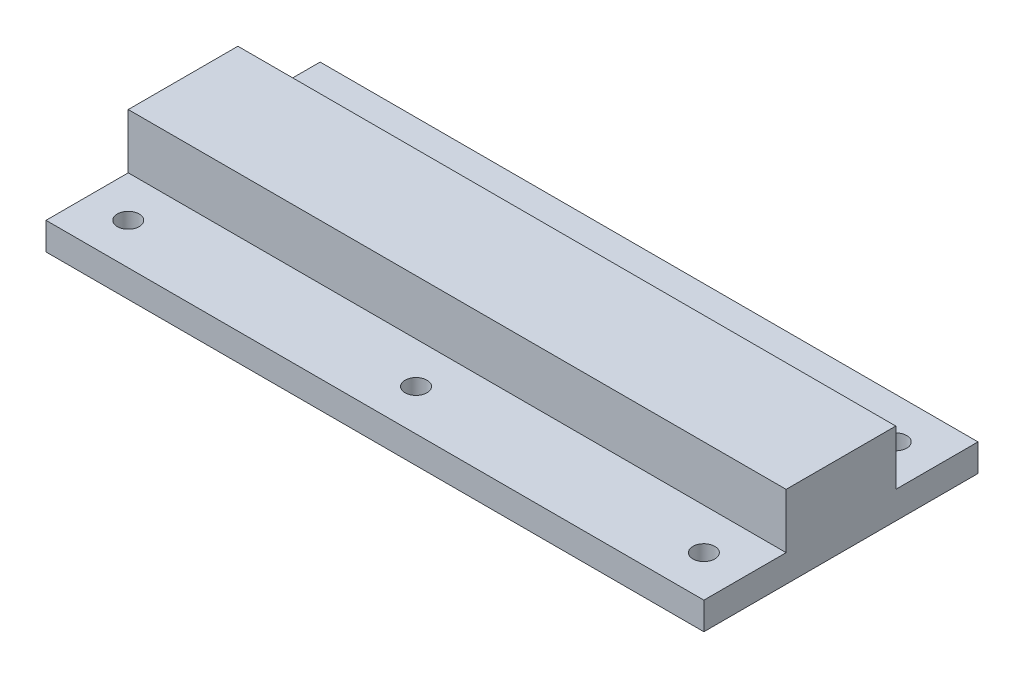
ISO-10303-21;
HEADER;
FILE_DESCRIPTION(('STEP AP214'),'2;1');
FILE_NAME('part.step','',(''),(''),'','','');
FILE_SCHEMA(('AUTOMOTIVE_DESIGN { 1 0 10303 214 1 1 1 1 }'));
ENDSEC;
DATA;
#1=APPLICATION_CONTEXT('core data for automotive mechanical design processes');
#2=APPLICATION_PROTOCOL_DEFINITION('international standard','automotive_design',2000,#1);
#3=PRODUCT_CONTEXT('',#1,'mechanical');
#4=PRODUCT('Part','Part','',(#3));
#5=PRODUCT_RELATED_PRODUCT_CATEGORY('part','',(#4));
#6=PRODUCT_DEFINITION_FORMATION('','',#4);
#7=PRODUCT_DEFINITION_CONTEXT('part definition',#1,'design');
#8=PRODUCT_DEFINITION('design','',#6,#7);
#9=PRODUCT_DEFINITION_SHAPE('','',#8);
#10=(LENGTH_UNIT() NAMED_UNIT(*) SI_UNIT(.MILLI.,.METRE.));
#11=(NAMED_UNIT(*) PLANE_ANGLE_UNIT() SI_UNIT($,.RADIAN.));
#12=(NAMED_UNIT(*) SI_UNIT($,.STERADIAN.) SOLID_ANGLE_UNIT());
#13=UNCERTAINTY_MEASURE_WITH_UNIT(LENGTH_MEASURE(1.E-05),#10,'distance_accuracy_value','');
#14=(GEOMETRIC_REPRESENTATION_CONTEXT(3) GLOBAL_UNCERTAINTY_ASSIGNED_CONTEXT((#13)) GLOBAL_UNIT_ASSIGNED_CONTEXT((#10,
#11,#12)) REPRESENTATION_CONTEXT('',''));
#15=CARTESIAN_POINT('',(0.,0.,0.));
#16=DIRECTION('',(0.,0.,1.));
#17=DIRECTION('',(1.,0.,0.));
#18=AXIS2_PLACEMENT_3D('',#15,#16,#17);
#19=CARTESIAN_POINT('',(-46.898123343935,15.,-34.5466375202052));
#20=DIRECTION('',(1.,0.,0.));
#21=DIRECTION('',(0.,0.,-1.));
#22=AXIS2_PLACEMENT_3D('',#19,#20,#21);
#23=PLANE('',#22);
#24=CARTESIAN_POINT('',(-46.898123343935,2.5,-9.54663752020524));
#25=DIRECTION('',(-1.,0.,0.));
#26=DIRECTION('',(0.,0.,1.));
#27=AXIS2_PLACEMENT_3D('',#24,#25,#26);
#28=CIRCLE('',#27,1.5);
#29=CARTESIAN_POINT('',(-46.898123343935,2.5,-8.04663752020524));
#30=VERTEX_POINT('',#29);
#31=EDGE_CURVE('E318',#30,#30,#28,.T.);
#32=ORIENTED_EDGE('',*,*,#31,.F.);
#33=EDGE_LOOP('',(#32));
#34=FACE_BOUND('',#33,.T.);
#35=DIRECTION('',(0.,0.,-1.));
#36=VECTOR('',#35,1.);
#37=CARTESIAN_POINT('',(-46.898123343935,5.,15.4533624797948));
#38=LINE('',#37,#36);
#39=CARTESIAN_POINT('',(-46.898123343935,5.,15.4533624797948));
#40=VERTEX_POINT('',#39);
#41=CARTESIAN_POINT('',(-46.898123343935,5.,0.45336247979476));
#42=VERTEX_POINT('',#41);
#43=EDGE_CURVE('E201',#40,#42,#38,.T.);
#44=ORIENTED_EDGE('',*,*,#43,.T.);
#45=DIRECTION('',(0.,-1.,0.));
#46=VECTOR('',#45,1.);
#47=CARTESIAN_POINT('',(-46.898123343935,15.,0.453362479794758));
#48=LINE('',#47,#46);
#49=CARTESIAN_POINT('',(-46.898123343935,15.,0.453362479794758));
#50=VERTEX_POINT('',#49);
#51=EDGE_CURVE('E185',#50,#42,#48,.T.);
#52=ORIENTED_EDGE('',*,*,#51,.F.);
#53=DIRECTION('',(0.,0.,1.));
#54=VECTOR('',#53,1.);
#55=CARTESIAN_POINT('',(-46.898123343935,15.,-34.5466375202052));
#56=LINE('',#55,#54);
#57=CARTESIAN_POINT('',(-46.898123343935,15.,-19.5466375202052));
#58=VERTEX_POINT('',#57);
#59=EDGE_CURVE('E322',#58,#50,#56,.T.);
#60=ORIENTED_EDGE('',*,*,#59,.F.);
#61=DIRECTION('',(0.,-1.,0.));
#62=VECTOR('',#61,1.);
#63=CARTESIAN_POINT('',(-46.898123343935,15.,-19.5466375202052));
#64=LINE('',#63,#62);
#65=CARTESIAN_POINT('',(-46.898123343935,5.,-19.5466375202052));
#66=VERTEX_POINT('',#65);
#67=EDGE_CURVE('E62',#58,#66,#64,.T.);
#68=ORIENTED_EDGE('',*,*,#67,.T.);
#69=DIRECTION('',(0.,0.,1.));
#70=VECTOR('',#69,1.);
#71=CARTESIAN_POINT('',(-46.898123343935,5.,-34.5466375202052));
#72=LINE('',#71,#70);
#73=CARTESIAN_POINT('',(-46.898123343935,5.,-34.5466375202052));
#74=VERTEX_POINT('',#73);
#75=EDGE_CURVE('E203',#74,#66,#72,.T.);
#76=ORIENTED_EDGE('',*,*,#75,.F.);
#77=DIRECTION('',(0.,-1.,0.));
#78=VECTOR('',#77,1.);
#79=CARTESIAN_POINT('',(-46.898123343935,15.,-34.5466375202052));
#80=LINE('',#79,#78);
#81=CARTESIAN_POINT('',(-46.898123343935,0.,-34.5466375202052));
#82=VERTEX_POINT('',#81);
#83=EDGE_CURVE('E343',#74,#82,#80,.T.);
#84=ORIENTED_EDGE('',*,*,#83,.T.);
#85=DIRECTION('',(0.,0.,1.));
#86=VECTOR('',#85,1.);
#87=CARTESIAN_POINT('',(-46.898123343935,0.,-34.5466375202052));
#88=LINE('',#87,#86);
#89=CARTESIAN_POINT('',(-46.898123343935,0.,15.4533624797948));
#90=VERTEX_POINT('',#89);
#91=EDGE_CURVE('E330',#82,#90,#88,.T.);
#92=ORIENTED_EDGE('',*,*,#91,.T.);
#93=DIRECTION('',(0.,-1.,0.));
#94=VECTOR('',#93,1.);
#95=CARTESIAN_POINT('',(-46.898123343935,15.,15.4533624797948));
#96=LINE('',#95,#94);
#97=EDGE_CURVE('E341',#40,#90,#96,.T.);
#98=ORIENTED_EDGE('',*,*,#97,.F.);
#99=EDGE_LOOP('',(#44,#52,#60,#68,#76,#84,#92,#98));
#100=FACE_BOUND('',#99,.T.);
#101=ADVANCED_FACE('F36',(#34,#100),#23,.F.);
#102=CARTESIAN_POINT('',(-46.898123343935,15.,15.4533624797948));
#103=DIRECTION('',(0.,0.,-1.));
#104=DIRECTION('',(-1.,0.,0.));
#105=AXIS2_PLACEMENT_3D('',#102,#103,#104);
#106=PLANE('',#105);
#107=DIRECTION('',(-1.,0.,0.));
#108=VECTOR('',#107,1.);
#109=CARTESIAN_POINT('',(73.101876656065,5.,15.4533624797948));
#110=LINE('',#109,#108);
#111=CARTESIAN_POINT('',(73.101876656065,5.,15.4533624797948));
#112=VERTEX_POINT('',#111);
#113=EDGE_CURVE('E182',#112,#40,#110,.T.);
#114=ORIENTED_EDGE('',*,*,#113,.T.);
#115=ORIENTED_EDGE('',*,*,#97,.T.);
#116=DIRECTION('',(1.,0.,0.));
#117=VECTOR('',#116,1.);
#118=CARTESIAN_POINT('',(-46.898123343935,0.,15.4533624797948));
#119=LINE('',#118,#117);
#120=CARTESIAN_POINT('',(73.101876656065,0.,15.4533624797948));
#121=VERTEX_POINT('',#120);
#122=EDGE_CURVE('E333',#90,#121,#119,.T.);
#123=ORIENTED_EDGE('',*,*,#122,.T.);
#124=DIRECTION('',(0.,-1.,0.));
#125=VECTOR('',#124,1.);
#126=CARTESIAN_POINT('',(73.101876656065,15.,15.4533624797948));
#127=LINE('',#126,#125);
#128=EDGE_CURVE('E339',#112,#121,#127,.T.);
#129=ORIENTED_EDGE('',*,*,#128,.F.);
#130=EDGE_LOOP('',(#114,#115,#123,#129));
#131=FACE_BOUND('',#130,.T.);
#132=ADVANCED_FACE('F404',(#131),#106,.F.);
#133=CARTESIAN_POINT('',(73.101876656065,15.,15.4533624797948));
#134=DIRECTION('',(-1.,0.,0.));
#135=DIRECTION('',(0.,0.,1.));
#136=AXIS2_PLACEMENT_3D('',#133,#134,#135);
#137=PLANE('',#136);
#138=DIRECTION('',(0.,0.,-1.));
#139=VECTOR('',#138,1.);
#140=CARTESIAN_POINT('',(73.101876656065,5.,15.4533624797948));
#141=LINE('',#140,#139);
#142=CARTESIAN_POINT('',(73.101876656065,5.,0.45336247979476));
#143=VERTEX_POINT('',#142);
#144=EDGE_CURVE('E176',#112,#143,#141,.T.);
#145=ORIENTED_EDGE('',*,*,#144,.F.);
#146=ORIENTED_EDGE('',*,*,#128,.T.);
#147=DIRECTION('',(0.,0.,-1.));
#148=VECTOR('',#147,1.);
#149=CARTESIAN_POINT('',(73.101876656065,0.,15.4533624797948));
#150=LINE('',#149,#148);
#151=CARTESIAN_POINT('',(73.101876656065,0.,-34.5466375202052));
#152=VERTEX_POINT('',#151);
#153=EDGE_CURVE('E325',#121,#152,#150,.T.);
#154=ORIENTED_EDGE('',*,*,#153,.T.);
#155=DIRECTION('',(0.,-1.,0.));
#156=VECTOR('',#155,1.);
#157=CARTESIAN_POINT('',(73.101876656065,15.,-34.5466375202052));
#158=LINE('',#157,#156);
#159=CARTESIAN_POINT('',(73.101876656065,5.,-34.5466375202052));
#160=VERTEX_POINT('',#159);
#161=EDGE_CURVE('E327',#160,#152,#158,.T.);
#162=ORIENTED_EDGE('',*,*,#161,.F.);
#163=DIRECTION('',(0.,0.,1.));
#164=VECTOR('',#163,1.);
#165=CARTESIAN_POINT('',(73.101876656065,5.,-34.5466375202052));
#166=LINE('',#165,#164);
#167=CARTESIAN_POINT('',(73.101876656065,5.,-19.5466375202052));
#168=VERTEX_POINT('',#167);
#169=EDGE_CURVE('E214',#160,#168,#166,.T.);
#170=ORIENTED_EDGE('',*,*,#169,.T.);
#171=DIRECTION('',(0.,-1.,0.));
#172=VECTOR('',#171,1.);
#173=CARTESIAN_POINT('',(73.101876656065,15.,-19.5466375202052));
#174=LINE('',#173,#172);
#175=CARTESIAN_POINT('',(73.101876656065,15.,-19.5466375202052));
#176=VERTEX_POINT('',#175);
#177=EDGE_CURVE('E208',#176,#168,#174,.T.);
#178=ORIENTED_EDGE('',*,*,#177,.F.);
#179=DIRECTION('',(0.,0.,-1.));
#180=VECTOR('',#179,1.);
#181=CARTESIAN_POINT('',(73.101876656065,15.,15.4533624797948));
#182=LINE('',#181,#180);
#183=CARTESIAN_POINT('',(73.101876656065,15.,0.453362479794758));
#184=VERTEX_POINT('',#183);
#185=EDGE_CURVE('E197',#184,#176,#182,.T.);
#186=ORIENTED_EDGE('',*,*,#185,.F.);
#187=DIRECTION('',(0.,-1.,0.));
#188=VECTOR('',#187,1.);
#189=CARTESIAN_POINT('',(73.101876656065,15.,0.453362479794758));
#190=LINE('',#189,#188);
#191=EDGE_CURVE('E54',#184,#143,#190,.T.);
#192=ORIENTED_EDGE('',*,*,#191,.T.);
#193=EDGE_LOOP('',(#145,#146,#154,#162,#170,#178,#186,#192));
#194=FACE_BOUND('',#193,.T.);
#195=ADVANCED_FACE('F194',(#194),#137,.F.);
#196=CARTESIAN_POINT('',(0.,15.,0.));
#197=DIRECTION('',(0.,1.,0.));
#198=DIRECTION('',(0.,0.,1.));
#199=AXIS2_PLACEMENT_3D('',#196,#197,#198);
#200=PLANE('',#199);
#201=DIRECTION('',(-1.,0.,0.));
#202=VECTOR('',#201,1.);
#203=CARTESIAN_POINT('',(73.101876656065,15.,0.453362479794758));
#204=LINE('',#203,#202);
#205=EDGE_CURVE('E191',#184,#50,#204,.T.);
#206=ORIENTED_EDGE('',*,*,#205,.F.);
#207=ORIENTED_EDGE('',*,*,#185,.T.);
#208=DIRECTION('',(-1.,0.,0.));
#209=VECTOR('',#208,1.);
#210=CARTESIAN_POINT('',(73.101876656065,15.,-19.5466375202052));
#211=LINE('',#210,#209);
#212=EDGE_CURVE('E209',#176,#58,#211,.T.);
#213=ORIENTED_EDGE('',*,*,#212,.T.);
#214=ORIENTED_EDGE('',*,*,#59,.T.);
#215=EDGE_LOOP('',(#206,#207,#213,#214));
#216=FACE_BOUND('',#215,.T.);
#217=ADVANCED_FACE('F411',(#216),#200,.T.);
#218=CARTESIAN_POINT('',(65.601876656065,15.,7.95336247979476));
#219=DIRECTION('',(0.,-1.,0.));
#220=DIRECTION('',(0.,0.,-1.));
#221=AXIS2_PLACEMENT_3D('',#218,#219,#220);
#222=CYLINDRICAL_SURFACE('',#221,2.);
#223=CARTESIAN_POINT('',(65.601876656065,0.,7.95336247979476));
#224=DIRECTION('',(0.,-1.,0.));
#225=DIRECTION('',(0.,0.,-1.));
#226=AXIS2_PLACEMENT_3D('',#223,#224,#225);
#227=CIRCLE('',#226,2.);
#228=CARTESIAN_POINT('',(65.601876656065,0.,5.95336247979476));
#229=VERTEX_POINT('',#228);
#230=EDGE_CURVE('E236',#229,#229,#227,.T.);
#231=ORIENTED_EDGE('',*,*,#230,.T.);
#232=EDGE_LOOP('',(#231));
#233=FACE_BOUND('',#232,.T.);
#234=CARTESIAN_POINT('',(65.601876656065,5.,7.95336247979476));
#235=DIRECTION('',(0.,1.,0.));
#236=DIRECTION('',(0.,0.,1.));
#237=AXIS2_PLACEMENT_3D('',#234,#235,#236);
#238=CIRCLE('',#237,2.);
#239=CARTESIAN_POINT('',(65.601876656065,5.,9.95336247979476));
#240=VERTEX_POINT('',#239);
#241=EDGE_CURVE('E229',#240,#240,#238,.F.);
#242=ORIENTED_EDGE('',*,*,#241,.F.);
#243=EDGE_LOOP('',(#242));
#244=FACE_BOUND('',#243,.T.);
#245=ADVANCED_FACE('F434',(#233,#244),#222,.F.);
#246=CARTESIAN_POINT('',(13.101876656065,15.,7.95336247979476));
#247=DIRECTION('',(0.,-1.,0.));
#248=DIRECTION('',(0.,0.,-1.));
#249=AXIS2_PLACEMENT_3D('',#246,#247,#248);
#250=CYLINDRICAL_SURFACE('',#249,2.);
#251=CARTESIAN_POINT('',(13.101876656065,0.,7.95336247979476));
#252=DIRECTION('',(0.,-1.,0.));
#253=DIRECTION('',(0.,0.,-1.));
#254=AXIS2_PLACEMENT_3D('',#251,#252,#253);
#255=CIRCLE('',#254,2.);
#256=CARTESIAN_POINT('',(13.101876656065,0.,5.95336247979476));
#257=VERTEX_POINT('',#256);
#258=EDGE_CURVE('E246',#257,#257,#255,.T.);
#259=ORIENTED_EDGE('',*,*,#258,.T.);
#260=EDGE_LOOP('',(#259));
#261=FACE_BOUND('',#260,.T.);
#262=CARTESIAN_POINT('',(13.101876656065,5.,7.95336247979476));
#263=DIRECTION('',(0.,1.,0.));
#264=DIRECTION('',(0.,0.,1.));
#265=AXIS2_PLACEMENT_3D('',#262,#263,#264);
#266=CIRCLE('',#265,2.);
#267=CARTESIAN_POINT('',(13.101876656065,5.,9.95336247979476));
#268=VERTEX_POINT('',#267);
#269=EDGE_CURVE('E226',#268,#268,#266,.F.);
#270=ORIENTED_EDGE('',*,*,#269,.F.);
#271=EDGE_LOOP('',(#270));
#272=FACE_BOUND('',#271,.T.);
#273=ADVANCED_FACE('F487',(#261,#272),#250,.F.);
#274=CARTESIAN_POINT('',(-39.398123343935,15.,7.95336247979476));
#275=DIRECTION('',(0.,-1.,0.));
#276=DIRECTION('',(0.,0.,-1.));
#277=AXIS2_PLACEMENT_3D('',#274,#275,#276);
#278=CYLINDRICAL_SURFACE('',#277,2.);
#279=CARTESIAN_POINT('',(-39.398123343935,0.,7.95336247979476));
#280=DIRECTION('',(0.,-1.,0.));
#281=DIRECTION('',(0.,0.,-1.));
#282=AXIS2_PLACEMENT_3D('',#279,#280,#281);
#283=CIRCLE('',#282,2.);
#284=CARTESIAN_POINT('',(-39.398123343935,0.,5.95336247979476));
#285=VERTEX_POINT('',#284);
#286=EDGE_CURVE('E242',#285,#285,#283,.T.);
#287=ORIENTED_EDGE('',*,*,#286,.T.);
#288=EDGE_LOOP('',(#287));
#289=FACE_BOUND('',#288,.T.);
#290=CARTESIAN_POINT('',(-39.398123343935,5.,7.95336247979476));
#291=DIRECTION('',(0.,1.,0.));
#292=DIRECTION('',(0.,0.,1.));
#293=AXIS2_PLACEMENT_3D('',#290,#291,#292);
#294=CIRCLE('',#293,2.);
#295=CARTESIAN_POINT('',(-39.398123343935,5.,9.95336247979476));
#296=VERTEX_POINT('',#295);
#297=EDGE_CURVE('E40',#296,#296,#294,.F.);
#298=ORIENTED_EDGE('',*,*,#297,.F.);
#299=EDGE_LOOP('',(#298));
#300=FACE_BOUND('',#299,.T.);
#301=ADVANCED_FACE('F491',(#289,#300),#278,.F.);
#302=CARTESIAN_POINT('',(74.3548353683358,0.,-9.54663752020526));
#303=DIRECTION('',(1.,0.,0.));
#304=DIRECTION('',(0.,0.,-1.));
#305=AXIS2_PLACEMENT_3D('',#302,#303,#304);
#306=CYLINDRICAL_SURFACE('',#305,7.49999999999999);
#307=DIRECTION('',(1.,0.,0.));
#308=VECTOR('',#307,1.);
#309=CARTESIAN_POINT('',(74.3548353683358,0.,-2.04663752020527));
#310=LINE('',#309,#308);
#311=CARTESIAN_POINT('',(28.101876656065,0.,-2.04663752020524));
#312=VERTEX_POINT('',#311);
#313=CARTESIAN_POINT('',(40.601876656065,0.,-2.04663752020524));
#314=VERTEX_POINT('',#313);
#315=EDGE_CURVE('E45',#312,#314,#310,.T.);
#316=ORIENTED_EDGE('',*,*,#315,.F.);
#317=CARTESIAN_POINT('',(28.101876656065,0.,-9.54663752020524));
#318=DIRECTION('',(-1.,0.,0.));
#319=DIRECTION('',(0.,0.,1.));
#320=AXIS2_PLACEMENT_3D('',#317,#318,#319);
#321=CIRCLE('',#320,7.5);
#322=CARTESIAN_POINT('',(28.101876656065,0.,-17.0466375202052));
#323=VERTEX_POINT('',#322);
#324=EDGE_CURVE('E266',#312,#323,#321,.T.);
#325=ORIENTED_EDGE('',*,*,#324,.T.);
#326=DIRECTION('',(1.,0.,0.));
#327=VECTOR('',#326,1.);
#328=CARTESIAN_POINT('',(74.3548353683358,0.,-17.0466375202052));
#329=LINE('',#328,#327);
#330=CARTESIAN_POINT('',(40.601876656065,0.,-17.0466375202052));
#331=VERTEX_POINT('',#330);
#332=EDGE_CURVE('E357',#331,#323,#329,.F.);
#333=ORIENTED_EDGE('',*,*,#332,.F.);
#334=CARTESIAN_POINT('',(40.601876656065,0.,-9.54663752020524));
#335=DIRECTION('',(-1.,0.,0.));
#336=DIRECTION('',(0.,0.,1.));
#337=AXIS2_PLACEMENT_3D('',#334,#335,#336);
#338=CIRCLE('',#337,7.5);
#339=EDGE_CURVE('E296',#314,#331,#338,.T.);
#340=ORIENTED_EDGE('',*,*,#339,.F.);
#341=EDGE_LOOP('',(#316,#325,#333,#340));
#342=FACE_BOUND('',#341,.T.);
#343=ADVANCED_FACE('F451',(#342),#306,.F.);
#344=CARTESIAN_POINT('',(53.101876656065,0.,-2.04663752020523));
#345=VERTEX_POINT('',#344);
#346=CARTESIAN_POINT('',(63.101876656065,0.,-2.04663752020527));
#347=VERTEX_POINT('',#346);
#348=EDGE_CURVE('E47',#345,#347,#310,.T.);
#349=ORIENTED_EDGE('',*,*,#348,.F.);
#350=CARTESIAN_POINT('',(53.101876656065,0.,-9.54663752020524));
#351=DIRECTION('',(-1.,0.,0.));
#352=DIRECTION('',(0.,0.,1.));
#353=AXIS2_PLACEMENT_3D('',#350,#351,#352);
#354=CIRCLE('',#353,7.50000000000001);
#355=CARTESIAN_POINT('',(53.101876656065,0.,-17.0466375202052));
#356=VERTEX_POINT('',#355);
#357=EDGE_CURVE('E293',#345,#356,#354,.T.);
#358=ORIENTED_EDGE('',*,*,#357,.T.);
#359=CARTESIAN_POINT('',(63.101876656065,0.,-17.0466375202052));
#360=VERTEX_POINT('',#359);
#361=EDGE_CURVE('E353',#360,#356,#329,.F.);
#362=ORIENTED_EDGE('',*,*,#361,.F.);
#363=CARTESIAN_POINT('',(63.101876656065,0.,-9.54663752020526));
#364=DIRECTION('',(1.,0.,0.));
#365=DIRECTION('',(0.,0.,-1.));
#366=AXIS2_PLACEMENT_3D('',#363,#364,#365);
#367=CIRCLE('',#366,7.49999999999999);
#368=EDGE_CURVE('E312',#360,#347,#367,.T.);
#369=ORIENTED_EDGE('',*,*,#368,.T.);
#370=EDGE_LOOP('',(#349,#358,#362,#369));
#371=FACE_BOUND('',#370,.T.);
#372=ADVANCED_FACE('F452',(#371),#306,.F.);
#373=CARTESIAN_POINT('',(73.101876656065,15.,-34.5466375202052));
#374=DIRECTION('',(0.,0.,1.));
#375=DIRECTION('',(1.,0.,0.));
#376=AXIS2_PLACEMENT_3D('',#373,#374,#375);
#377=PLANE('',#376);
#378=ORIENTED_EDGE('',*,*,#83,.F.);
#379=DIRECTION('',(-1.,0.,0.));
#380=VECTOR('',#379,1.);
#381=CARTESIAN_POINT('',(73.101876656065,5.,-34.5466375202052));
#382=LINE('',#381,#380);
#383=EDGE_CURVE('E211',#160,#74,#382,.T.);
#384=ORIENTED_EDGE('',*,*,#383,.F.);
#385=ORIENTED_EDGE('',*,*,#161,.T.);
#386=DIRECTION('',(-1.,0.,0.));
#387=VECTOR('',#386,1.);
#388=CARTESIAN_POINT('',(73.101876656065,0.,-34.5466375202052));
#389=LINE('',#388,#387);
#390=EDGE_CURVE('E321',#152,#82,#389,.T.);
#391=ORIENTED_EDGE('',*,*,#390,.T.);
#392=EDGE_LOOP('',(#378,#384,#385,#391));
#393=FACE_BOUND('',#392,.T.);
#394=ADVANCED_FACE('F38',(#393),#377,.F.);
#395=CARTESIAN_POINT('',(0.,0.,0.));
#396=DIRECTION('',(0.,1.,0.));
#397=DIRECTION('',(0.,0.,1.));
#398=AXIS2_PLACEMENT_3D('',#395,#396,#397);
#399=PLANE('',#398);
#400=CARTESIAN_POINT('',(-39.398123343935,0.,-27.0466375202052));
#401=DIRECTION('',(0.,1.,0.));
#402=DIRECTION('',(0.,0.,1.));
#403=AXIS2_PLACEMENT_3D('',#400,#401,#402);
#404=CIRCLE('',#403,2.);
#405=CARTESIAN_POINT('',(-39.398123343935,0.,-25.0466375202052));
#406=VERTEX_POINT('',#405);
#407=EDGE_CURVE('E233',#406,#406,#404,.T.);
#408=ORIENTED_EDGE('',*,*,#407,.T.);
#409=EDGE_LOOP('',(#408));
#410=FACE_BOUND('',#409,.T.);
#411=CARTESIAN_POINT('',(13.101876656065,0.,-27.0466375202052));
#412=DIRECTION('',(0.,1.,0.));
#413=DIRECTION('',(0.,0.,1.));
#414=AXIS2_PLACEMENT_3D('',#411,#412,#413);
#415=CIRCLE('',#414,2.);
#416=CARTESIAN_POINT('',(13.101876656065,0.,-25.0466375202052));
#417=VERTEX_POINT('',#416);
#418=EDGE_CURVE('E237',#417,#417,#415,.T.);
#419=ORIENTED_EDGE('',*,*,#418,.T.);
#420=EDGE_LOOP('',(#419));
#421=FACE_BOUND('',#420,.T.);
#422=CARTESIAN_POINT('',(65.601876656065,0.,-27.0466375202052));
#423=DIRECTION('',(0.,1.,0.));
#424=DIRECTION('',(0.,0.,1.));
#425=AXIS2_PLACEMENT_3D('',#422,#423,#424);
#426=CIRCLE('',#425,2.);
#427=CARTESIAN_POINT('',(65.601876656065,0.,-25.0466375202053));
#428=VERTEX_POINT('',#427);
#429=EDGE_CURVE('E232',#428,#428,#426,.T.);
#430=ORIENTED_EDGE('',*,*,#429,.T.);
#431=EDGE_LOOP('',(#430));
#432=FACE_BOUND('',#431,.T.);
#433=ORIENTED_EDGE('',*,*,#286,.F.);
#434=EDGE_LOOP('',(#433));
#435=FACE_BOUND('',#434,.T.);
#436=ORIENTED_EDGE('',*,*,#258,.F.);
#437=EDGE_LOOP('',(#436));
#438=FACE_BOUND('',#437,.T.);
#439=ORIENTED_EDGE('',*,*,#230,.F.);
#440=EDGE_LOOP('',(#439));
#441=FACE_BOUND('',#440,.T.);
#442=DIRECTION('',(0.,0.,-1.));
#443=VECTOR('',#442,1.);
#444=CARTESIAN_POINT('',(3.10187665606497,0.,0.));
#445=LINE('',#444,#443);
#446=CARTESIAN_POINT('',(3.10187665606497,0.,0.453362479794734));
#447=VERTEX_POINT('',#446);
#448=CARTESIAN_POINT('',(3.10187665606497,0.,-2.04663752020526));
#449=VERTEX_POINT('',#448);
#450=EDGE_CURVE('E352',#447,#449,#445,.T.);
#451=ORIENTED_EDGE('',*,*,#450,.T.);
#452=CARTESIAN_POINT('',(15.601876656065,0.,-2.04663752020525));
#453=VERTEX_POINT('',#452);
#454=EDGE_CURVE('E11',#449,#453,#310,.T.);
#455=ORIENTED_EDGE('',*,*,#454,.T.);
#456=DIRECTION('',(0.,0.,1.));
#457=VECTOR('',#456,1.);
#458=CARTESIAN_POINT('',(15.601876656065,0.,-2.04663752020525));
#459=LINE('',#458,#457);
#460=CARTESIAN_POINT('',(15.601876656065,0.,-3.54663752020524));
#461=VERTEX_POINT('',#460);
#462=EDGE_CURVE('E264',#461,#453,#459,.T.);
#463=ORIENTED_EDGE('',*,*,#462,.F.);
#464=DIRECTION('',(-1.,0.,0.));
#465=VECTOR('',#464,1.);
#466=CARTESIAN_POINT('',(28.101876656065,0.,-3.54663752020524));
#467=LINE('',#466,#465);
#468=CARTESIAN_POINT('',(28.101876656065,0.,-3.54663752020524));
#469=VERTEX_POINT('',#468);
#470=EDGE_CURVE('E261',#469,#461,#467,.T.);
#471=ORIENTED_EDGE('',*,*,#470,.F.);
#472=DIRECTION('',(0.,0.,-1.));
#473=VECTOR('',#472,1.);
#474=CARTESIAN_POINT('',(28.101876656065,0.,-2.04663752020524));
#475=LINE('',#474,#473);
#476=EDGE_CURVE('E258',#312,#469,#475,.T.);
#477=ORIENTED_EDGE('',*,*,#476,.F.);
#478=ORIENTED_EDGE('',*,*,#315,.T.);
#479=DIRECTION('',(0.,0.,1.));
#480=VECTOR('',#479,1.);
#481=CARTESIAN_POINT('',(40.601876656065,0.,-2.04663752020524));
#482=LINE('',#481,#480);
#483=CARTESIAN_POINT('',(40.601876656065,0.,-3.54663752020523));
#484=VERTEX_POINT('',#483);
#485=EDGE_CURVE('E290',#484,#314,#482,.T.);
#486=ORIENTED_EDGE('',*,*,#485,.F.);
#487=DIRECTION('',(-1.,0.,0.));
#488=VECTOR('',#487,1.);
#489=CARTESIAN_POINT('',(53.101876656065,0.,-3.54663752020523));
#490=LINE('',#489,#488);
#491=CARTESIAN_POINT('',(53.101876656065,0.,-3.54663752020523));
#492=VERTEX_POINT('',#491);
#493=EDGE_CURVE('E287',#492,#484,#490,.T.);
#494=ORIENTED_EDGE('',*,*,#493,.F.);
#495=DIRECTION('',(0.,0.,-1.));
#496=VECTOR('',#495,1.);
#497=CARTESIAN_POINT('',(53.101876656065,0.,-2.04663752020523));
#498=LINE('',#497,#496);
#499=EDGE_CURVE('E284',#345,#492,#498,.T.);
#500=ORIENTED_EDGE('',*,*,#499,.F.);
#501=ORIENTED_EDGE('',*,*,#348,.T.);
#502=DIRECTION('',(0.,0.,-1.));
#503=VECTOR('',#502,1.);
#504=CARTESIAN_POINT('',(63.101876656065,0.,0.));
#505=LINE('',#504,#503);
#506=EDGE_CURVE('E356',#347,#360,#505,.T.);
#507=ORIENTED_EDGE('',*,*,#506,.T.);
#508=ORIENTED_EDGE('',*,*,#361,.T.);
#509=DIRECTION('',(0.,0.,1.));
#510=VECTOR('',#509,1.);
#511=CARTESIAN_POINT('',(53.101876656065,0.,-17.0466375202052));
#512=LINE('',#511,#510);
#513=CARTESIAN_POINT('',(53.101876656065,0.,-15.5466375202052));
#514=VERTEX_POINT('',#513);
#515=EDGE_CURVE('E276',#356,#514,#512,.T.);
#516=ORIENTED_EDGE('',*,*,#515,.T.);
#517=DIRECTION('',(-1.,0.,0.));
#518=VECTOR('',#517,1.);
#519=CARTESIAN_POINT('',(53.101876656065,0.,-15.5466375202052));
#520=LINE('',#519,#518);
#521=CARTESIAN_POINT('',(40.601876656065,0.,-15.5466375202052));
#522=VERTEX_POINT('',#521);
#523=EDGE_CURVE('E279',#514,#522,#520,.T.);
#524=ORIENTED_EDGE('',*,*,#523,.T.);
#525=DIRECTION('',(0.,0.,-1.));
#526=VECTOR('',#525,1.);
#527=CARTESIAN_POINT('',(40.601876656065,0.,-17.0466375202052));
#528=LINE('',#527,#526);
#529=EDGE_CURVE('E282',#522,#331,#528,.T.);
#530=ORIENTED_EDGE('',*,*,#529,.T.);
#531=ORIENTED_EDGE('',*,*,#332,.T.);
#532=DIRECTION('',(0.,0.,1.));
#533=VECTOR('',#532,1.);
#534=CARTESIAN_POINT('',(28.101876656065,0.,-17.0466375202052));
#535=LINE('',#534,#533);
#536=CARTESIAN_POINT('',(28.101876656065,0.,-15.5466375202052));
#537=VERTEX_POINT('',#536);
#538=EDGE_CURVE('E245',#323,#537,#535,.T.);
#539=ORIENTED_EDGE('',*,*,#538,.T.);
#540=DIRECTION('',(-1.,0.,0.));
#541=VECTOR('',#540,1.);
#542=CARTESIAN_POINT('',(28.101876656065,0.,-15.5466375202052));
#543=LINE('',#542,#541);
#544=CARTESIAN_POINT('',(15.601876656065,0.,-15.5466375202052));
#545=VERTEX_POINT('',#544);
#546=EDGE_CURVE('E253',#537,#545,#543,.T.);
#547=ORIENTED_EDGE('',*,*,#546,.T.);
#548=DIRECTION('',(0.,0.,-1.));
#549=VECTOR('',#548,1.);
#550=CARTESIAN_POINT('',(15.601876656065,0.,-17.0466375202052));
#551=LINE('',#550,#549);
#552=CARTESIAN_POINT('',(15.601876656065,0.,-17.0466375202052));
#553=VERTEX_POINT('',#552);
#554=EDGE_CURVE('E256',#545,#553,#551,.T.);
#555=ORIENTED_EDGE('',*,*,#554,.T.);
#556=CARTESIAN_POINT('',(3.10187665606497,0.,-17.0466375202052));
#557=VERTEX_POINT('',#556);
#558=EDGE_CURVE('E351',#553,#557,#329,.F.);
#559=ORIENTED_EDGE('',*,*,#558,.T.);
#560=CARTESIAN_POINT('',(3.10187665606497,0.,-19.5466375202052));
#561=VERTEX_POINT('',#560);
#562=EDGE_CURVE('E348',#557,#561,#445,.T.);
#563=ORIENTED_EDGE('',*,*,#562,.T.);
#564=DIRECTION('',(1.,0.,0.));
#565=VECTOR('',#564,1.);
#566=CARTESIAN_POINT('',(74.3548353683358,0.,-19.5466375202052));
#567=LINE('',#566,#565);
#568=CARTESIAN_POINT('',(-36.898123343935,0.,-19.5466375202052));
#569=VERTEX_POINT('',#568);
#570=EDGE_CURVE('E345',#561,#569,#567,.F.);
#571=ORIENTED_EDGE('',*,*,#570,.T.);
#572=DIRECTION('',(0.,0.,1.));
#573=VECTOR('',#572,1.);
#574=CARTESIAN_POINT('',(-36.898123343935,0.,0.));
#575=LINE('',#574,#573);
#576=CARTESIAN_POINT('',(-36.898123343935,0.,0.453362479794744));
#577=VERTEX_POINT('',#576);
#578=EDGE_CURVE('E360',#569,#577,#575,.T.);
#579=ORIENTED_EDGE('',*,*,#578,.T.);
#580=DIRECTION('',(1.,0.,0.));
#581=VECTOR('',#580,1.);
#582=CARTESIAN_POINT('',(74.3548353683358,0.,0.453362479794727));
#583=LINE('',#582,#581);
#584=EDGE_CURVE('E363',#577,#447,#583,.T.);
#585=ORIENTED_EDGE('',*,*,#584,.T.);
#586=EDGE_LOOP('',(#451,#455,#463,#471,#477,#478,#486,#494,#500,#501,#507,#508,#516,#524,#530,
#531,#539,#547,#555,#559,#563,#571,#579,#585));
#587=FACE_BOUND('',#586,.T.);
#588=ORIENTED_EDGE('',*,*,#390,.F.);
#589=ORIENTED_EDGE('',*,*,#153,.F.);
#590=ORIENTED_EDGE('',*,*,#122,.F.);
#591=ORIENTED_EDGE('',*,*,#91,.F.);
#592=EDGE_LOOP('',(#588,#589,#590,#591));
#593=FACE_BOUND('',#592,.T.);
#594=ADVANCED_FACE('F378',(#410,#421,#432,#435,#438,#441,#587,#593),#399,.F.);
#595=CARTESIAN_POINT('',(-36.898123343935,2.5,-9.54663752020524));
#596=DIRECTION('',(-1.,0.,0.));
#597=DIRECTION('',(0.,0.,1.));
#598=AXIS2_PLACEMENT_3D('',#595,#596,#597);
#599=CYLINDRICAL_SURFACE('',#598,1.5);
#600=CARTESIAN_POINT('',(-36.898123343935,2.5,-9.54663752020524));
#601=DIRECTION('',(-1.,0.,0.));
#602=DIRECTION('',(0.,0.,1.));
#603=AXIS2_PLACEMENT_3D('',#600,#601,#602);
#604=CIRCLE('',#603,1.5);
#605=CARTESIAN_POINT('',(-36.898123343935,2.5,-8.04663752020524));
#606=VERTEX_POINT('',#605);
#607=EDGE_CURVE('E315',#606,#606,#604,.T.);
#608=ORIENTED_EDGE('',*,*,#607,.F.);
#609=EDGE_LOOP('',(#608));
#610=FACE_BOUND('',#609,.T.);
#611=ORIENTED_EDGE('',*,*,#31,.T.);
#612=EDGE_LOOP('',(#611));
#613=FACE_BOUND('',#612,.T.);
#614=ADVANCED_FACE('F381',(#610,#613),#599,.F.);
#615=CARTESIAN_POINT('',(-36.898123343935,0.,-19.5466375202052));
#616=DIRECTION('',(-1.,0.,0.));
#617=DIRECTION('',(0.,0.,1.));
#618=AXIS2_PLACEMENT_3D('',#615,#616,#617);
#619=PLANE('',#618);
#620=ORIENTED_EDGE('',*,*,#607,.T.);
#621=EDGE_LOOP('',(#620));
#622=FACE_BOUND('',#621,.T.);
#623=CARTESIAN_POINT('',(-36.898123343935,0.,-9.54663752020524));
#624=DIRECTION('',(1.,0.,0.));
#625=DIRECTION('',(0.,0.,-1.));
#626=AXIS2_PLACEMENT_3D('',#623,#624,#625);
#627=CIRCLE('',#626,9.99999999999999);
#628=EDGE_CURVE('E303',#569,#577,#627,.T.);
#629=ORIENTED_EDGE('',*,*,#628,.T.);
#630=ORIENTED_EDGE('',*,*,#578,.F.);
#631=EDGE_LOOP('',(#629,#630));
#632=FACE_BOUND('',#631,.T.);
#633=ADVANCED_FACE('F437',(#622,#632),#619,.F.);
#634=CARTESIAN_POINT('',(63.101876656065,0.,-9.54663752020524));
#635=DIRECTION('',(1.,0.,0.));
#636=DIRECTION('',(0.,0.,-1.));
#637=AXIS2_PLACEMENT_3D('',#634,#635,#636);
#638=PLANE('',#637);
#639=ORIENTED_EDGE('',*,*,#368,.F.);
#640=ORIENTED_EDGE('',*,*,#506,.F.);
#641=EDGE_LOOP('',(#639,#640));
#642=FACE_BOUND('',#641,.T.);
#643=ADVANCED_FACE('F441',(#642),#638,.F.);
#644=ORIENTED_EDGE('',*,*,#558,.F.);
#645=CARTESIAN_POINT('',(15.601876656065,0.,-9.54663752020524));
#646=DIRECTION('',(-1.,0.,0.));
#647=DIRECTION('',(0.,0.,1.));
#648=AXIS2_PLACEMENT_3D('',#645,#646,#647);
#649=CIRCLE('',#648,7.5);
#650=EDGE_CURVE('E269',#453,#553,#649,.T.);
#651=ORIENTED_EDGE('',*,*,#650,.F.);
#652=ORIENTED_EDGE('',*,*,#454,.F.);
#653=CARTESIAN_POINT('',(3.10187665606497,0.,-9.54663752020525));
#654=DIRECTION('',(1.,0.,0.));
#655=DIRECTION('',(0.,0.,-1.));
#656=AXIS2_PLACEMENT_3D('',#653,#654,#655);
#657=CIRCLE('',#656,7.49999999999998);
#658=EDGE_CURVE('E309',#557,#449,#657,.T.);
#659=ORIENTED_EDGE('',*,*,#658,.F.);
#660=EDGE_LOOP('',(#644,#651,#652,#659));
#661=FACE_BOUND('',#660,.T.);
#662=ADVANCED_FACE('F445',(#661),#306,.F.);
#663=CARTESIAN_POINT('',(3.10187665606497,0.,-17.0466375202052));
#664=DIRECTION('',(1.,0.,0.));
#665=DIRECTION('',(0.,0.,-1.));
#666=AXIS2_PLACEMENT_3D('',#663,#664,#665);
#667=PLANE('',#666);
#668=CARTESIAN_POINT('',(3.10187665606497,0.,-9.54663752020525));
#669=DIRECTION('',(1.,0.,0.));
#670=DIRECTION('',(0.,0.,-1.));
#671=AXIS2_PLACEMENT_3D('',#668,#669,#670);
#672=CIRCLE('',#671,9.99999999999998);
#673=EDGE_CURVE('E306',#561,#447,#672,.T.);
#674=ORIENTED_EDGE('',*,*,#673,.F.);
#675=ORIENTED_EDGE('',*,*,#562,.F.);
#676=ORIENTED_EDGE('',*,*,#658,.T.);
#677=ORIENTED_EDGE('',*,*,#450,.F.);
#678=EDGE_LOOP('',(#674,#675,#676,#677));
#679=FACE_BOUND('',#678,.T.);
#680=ADVANCED_FACE('F449',(#679),#667,.F.);
#681=CARTESIAN_POINT('',(74.3548353683358,0.,-9.54663752020526));
#682=DIRECTION('',(1.,0.,0.));
#683=DIRECTION('',(0.,0.,-1.));
#684=AXIS2_PLACEMENT_3D('',#681,#682,#683);
#685=CYLINDRICAL_SURFACE('',#684,9.99999999999998);
#686=ORIENTED_EDGE('',*,*,#628,.F.);
#687=ORIENTED_EDGE('',*,*,#570,.F.);
#688=ORIENTED_EDGE('',*,*,#673,.T.);
#689=ORIENTED_EDGE('',*,*,#584,.F.);
#690=EDGE_LOOP('',(#686,#687,#688,#689));
#691=FACE_BOUND('',#690,.T.);
#692=ADVANCED_FACE('F455',(#691),#685,.F.);
#693=CARTESIAN_POINT('',(53.101876656065,0.,-2.04663752020523));
#694=DIRECTION('',(1.,0.,0.));
#695=DIRECTION('',(0.,0.,-1.));
#696=AXIS2_PLACEMENT_3D('',#693,#694,#695);
#697=PLANE('',#696);
#698=CARTESIAN_POINT('',(53.101876656065,0.,-9.54663752020524));
#699=DIRECTION('',(-1.,0.,0.));
#700=DIRECTION('',(0.,0.,1.));
#701=AXIS2_PLACEMENT_3D('',#698,#699,#700);
#702=CIRCLE('',#701,6.00000000000001);
#703=EDGE_CURVE('E301',#492,#514,#702,.T.);
#704=ORIENTED_EDGE('',*,*,#703,.T.);
#705=ORIENTED_EDGE('',*,*,#515,.F.);
#706=ORIENTED_EDGE('',*,*,#357,.F.);
#707=ORIENTED_EDGE('',*,*,#499,.T.);
#708=EDGE_LOOP('',(#704,#705,#706,#707));
#709=FACE_BOUND('',#708,.T.);
#710=ADVANCED_FACE('F459',(#709),#697,.T.);
#711=CARTESIAN_POINT('',(85.7448160744241,0.,-9.54663752020524));
#712=DIRECTION('',(-1.,0.,0.));
#713=DIRECTION('',(0.,0.,1.));
#714=AXIS2_PLACEMENT_3D('',#711,#712,#713);
#715=CYLINDRICAL_SURFACE('',#714,6.00000000000001);
#716=CARTESIAN_POINT('',(40.601876656065,0.,-9.54663752020524));
#717=DIRECTION('',(-1.,0.,0.));
#718=DIRECTION('',(0.,0.,1.));
#719=AXIS2_PLACEMENT_3D('',#716,#717,#718);
#720=CIRCLE('',#719,6.00000000000001);
#721=EDGE_CURVE('E299',#484,#522,#720,.T.);
#722=ORIENTED_EDGE('',*,*,#721,.T.);
#723=ORIENTED_EDGE('',*,*,#523,.F.);
#724=ORIENTED_EDGE('',*,*,#703,.F.);
#725=ORIENTED_EDGE('',*,*,#493,.T.);
#726=EDGE_LOOP('',(#722,#723,#724,#725));
#727=FACE_BOUND('',#726,.T.);
#728=ADVANCED_FACE('F461',(#727),#715,.F.);
#729=CARTESIAN_POINT('',(40.601876656065,0.,-2.04663752020524));
#730=DIRECTION('',(-1.,0.,0.));
#731=DIRECTION('',(0.,0.,1.));
#732=AXIS2_PLACEMENT_3D('',#729,#730,#731);
#733=PLANE('',#732);
#734=ORIENTED_EDGE('',*,*,#339,.T.);
#735=ORIENTED_EDGE('',*,*,#529,.F.);
#736=ORIENTED_EDGE('',*,*,#721,.F.);
#737=ORIENTED_EDGE('',*,*,#485,.T.);
#738=EDGE_LOOP('',(#734,#735,#736,#737));
#739=FACE_BOUND('',#738,.T.);
#740=ADVANCED_FACE('F464',(#739),#733,.T.);
#741=CARTESIAN_POINT('',(28.101876656065,0.,-2.04663752020524));
#742=DIRECTION('',(1.,0.,0.));
#743=DIRECTION('',(0.,0.,-1.));
#744=AXIS2_PLACEMENT_3D('',#741,#742,#743);
#745=PLANE('',#744);
#746=CARTESIAN_POINT('',(28.1018766560649,0.,-9.54663752020524));
#747=DIRECTION('',(-1.,0.,0.));
#748=DIRECTION('',(0.,0.,1.));
#749=AXIS2_PLACEMENT_3D('',#746,#747,#748);
#750=CIRCLE('',#749,6.);
#751=EDGE_CURVE('E274',#469,#537,#750,.T.);
#752=ORIENTED_EDGE('',*,*,#751,.T.);
#753=ORIENTED_EDGE('',*,*,#538,.F.);
#754=ORIENTED_EDGE('',*,*,#324,.F.);
#755=ORIENTED_EDGE('',*,*,#476,.T.);
#756=EDGE_LOOP('',(#752,#753,#754,#755));
#757=FACE_BOUND('',#756,.T.);
#758=ADVANCED_FACE('F468',(#757),#745,.T.);
#759=CARTESIAN_POINT('',(95.0378304940571,0.,-9.54663752020523));
#760=DIRECTION('',(-1.,0.,0.));
#761=DIRECTION('',(0.,0.,1.));
#762=AXIS2_PLACEMENT_3D('',#759,#760,#761);
#763=CYLINDRICAL_SURFACE('',#762,6.);
#764=CARTESIAN_POINT('',(15.601876656065,0.,-9.54663752020524));
#765=DIRECTION('',(-1.,0.,0.));
#766=DIRECTION('',(0.,0.,1.));
#767=AXIS2_PLACEMENT_3D('',#764,#765,#766);
#768=CIRCLE('',#767,6.);
#769=EDGE_CURVE('E272',#461,#545,#768,.T.);
#770=ORIENTED_EDGE('',*,*,#769,.T.);
#771=ORIENTED_EDGE('',*,*,#546,.F.);
#772=ORIENTED_EDGE('',*,*,#751,.F.);
#773=ORIENTED_EDGE('',*,*,#470,.T.);
#774=EDGE_LOOP('',(#770,#771,#772,#773));
#775=FACE_BOUND('',#774,.T.);
#776=ADVANCED_FACE('F473',(#775),#763,.F.);
#777=CARTESIAN_POINT('',(15.601876656065,0.,-2.04663752020525));
#778=DIRECTION('',(-1.,0.,0.));
#779=DIRECTION('',(0.,0.,1.));
#780=AXIS2_PLACEMENT_3D('',#777,#778,#779);
#781=PLANE('',#780);
#782=ORIENTED_EDGE('',*,*,#650,.T.);
#783=ORIENTED_EDGE('',*,*,#554,.F.);
#784=ORIENTED_EDGE('',*,*,#769,.F.);
#785=ORIENTED_EDGE('',*,*,#462,.T.);
#786=EDGE_LOOP('',(#782,#783,#784,#785));
#787=FACE_BOUND('',#786,.T.);
#788=ADVANCED_FACE('F476',(#787),#781,.T.);
#789=CARTESIAN_POINT('',(65.601876656065,15.,-27.0466375202052));
#790=DIRECTION('',(0.,-1.,0.));
#791=DIRECTION('',(0.,0.,-1.));
#792=AXIS2_PLACEMENT_3D('',#789,#790,#791);
#793=CYLINDRICAL_SURFACE('',#792,2.);
#794=CARTESIAN_POINT('',(65.601876656065,5.,-27.0466375202052));
#795=DIRECTION('',(0.,-1.,0.));
#796=DIRECTION('',(0.,0.,-1.));
#797=AXIS2_PLACEMENT_3D('',#794,#795,#796);
#798=CIRCLE('',#797,2.);
#799=CARTESIAN_POINT('',(65.601876656065,5.,-29.0466375202052));
#800=VERTEX_POINT('',#799);
#801=EDGE_CURVE('E223',#800,#800,#798,.T.);
#802=ORIENTED_EDGE('',*,*,#801,.F.);
#803=EDGE_LOOP('',(#802));
#804=FACE_BOUND('',#803,.T.);
#805=ORIENTED_EDGE('',*,*,#429,.F.);
#806=EDGE_LOOP('',(#805));
#807=FACE_BOUND('',#806,.T.);
#808=ADVANCED_FACE('F480',(#804,#807),#793,.F.);
#809=CARTESIAN_POINT('',(13.101876656065,15.,-27.0466375202052));
#810=DIRECTION('',(0.,-1.,0.));
#811=DIRECTION('',(0.,0.,-1.));
#812=AXIS2_PLACEMENT_3D('',#809,#810,#811);
#813=CYLINDRICAL_SURFACE('',#812,2.);
#814=CARTESIAN_POINT('',(13.101876656065,5.,-27.0466375202052));
#815=DIRECTION('',(0.,-1.,0.));
#816=DIRECTION('',(0.,0.,-1.));
#817=AXIS2_PLACEMENT_3D('',#814,#815,#816);
#818=CIRCLE('',#817,2.);
#819=CARTESIAN_POINT('',(13.101876656065,5.,-29.0466375202052));
#820=VERTEX_POINT('',#819);
#821=EDGE_CURVE('E220',#820,#820,#818,.T.);
#822=ORIENTED_EDGE('',*,*,#821,.F.);
#823=EDGE_LOOP('',(#822));
#824=FACE_BOUND('',#823,.T.);
#825=ORIENTED_EDGE('',*,*,#418,.F.);
#826=EDGE_LOOP('',(#825));
#827=FACE_BOUND('',#826,.T.);
#828=ADVANCED_FACE('F374',(#824,#827),#813,.F.);
#829=CARTESIAN_POINT('',(-39.398123343935,15.,-27.0466375202052));
#830=DIRECTION('',(0.,-1.,0.));
#831=DIRECTION('',(0.,0.,-1.));
#832=AXIS2_PLACEMENT_3D('',#829,#830,#831);
#833=CYLINDRICAL_SURFACE('',#832,2.);
#834=CARTESIAN_POINT('',(-39.398123343935,5.,-27.0466375202052));
#835=DIRECTION('',(0.,-1.,0.));
#836=DIRECTION('',(0.,0.,-1.));
#837=AXIS2_PLACEMENT_3D('',#834,#835,#836);
#838=CIRCLE('',#837,2.);
#839=CARTESIAN_POINT('',(-39.398123343935,5.,-29.0466375202052));
#840=VERTEX_POINT('',#839);
#841=EDGE_CURVE('E190',#840,#840,#838,.T.);
#842=ORIENTED_EDGE('',*,*,#841,.F.);
#843=EDGE_LOOP('',(#842));
#844=FACE_BOUND('',#843,.T.);
#845=ORIENTED_EDGE('',*,*,#407,.F.);
#846=EDGE_LOOP('',(#845));
#847=FACE_BOUND('',#846,.T.);
#848=ADVANCED_FACE('F371',(#844,#847),#833,.F.);
#849=CARTESIAN_POINT('',(73.101876656065,5.,-34.5466375202052));
#850=DIRECTION('',(0.,-1.,0.));
#851=DIRECTION('',(0.,0.,-1.));
#852=AXIS2_PLACEMENT_3D('',#849,#850,#851);
#853=PLANE('',#852);
#854=ORIENTED_EDGE('',*,*,#801,.T.);
#855=EDGE_LOOP('',(#854));
#856=FACE_BOUND('',#855,.T.);
#857=ORIENTED_EDGE('',*,*,#821,.T.);
#858=EDGE_LOOP('',(#857));
#859=FACE_BOUND('',#858,.T.);
#860=ORIENTED_EDGE('',*,*,#841,.T.);
#861=EDGE_LOOP('',(#860));
#862=FACE_BOUND('',#861,.T.);
#863=ORIENTED_EDGE('',*,*,#75,.T.);
#864=DIRECTION('',(-1.,0.,0.));
#865=VECTOR('',#864,1.);
#866=CARTESIAN_POINT('',(73.101876656065,5.,-19.5466375202052));
#867=LINE('',#866,#865);
#868=EDGE_CURVE('E206',#168,#66,#867,.T.);
#869=ORIENTED_EDGE('',*,*,#868,.F.);
#870=ORIENTED_EDGE('',*,*,#169,.F.);
#871=ORIENTED_EDGE('',*,*,#383,.T.);
#872=EDGE_LOOP('',(#863,#869,#870,#871));
#873=FACE_BOUND('',#872,.T.);
#874=ADVANCED_FACE('F368',(#856,#859,#862,#873),#853,.F.);
#875=CARTESIAN_POINT('',(73.101876656065,15.,-19.5466375202052));
#876=DIRECTION('',(0.,0.,-1.));
#877=DIRECTION('',(0.,1.,0.));
#878=AXIS2_PLACEMENT_3D('',#875,#876,#877);
#879=PLANE('',#878);
#880=ORIENTED_EDGE('',*,*,#67,.F.);
#881=ORIENTED_EDGE('',*,*,#212,.F.);
#882=ORIENTED_EDGE('',*,*,#177,.T.);
#883=ORIENTED_EDGE('',*,*,#868,.T.);
#884=EDGE_LOOP('',(#880,#881,#882,#883));
#885=FACE_BOUND('',#884,.T.);
#886=ADVANCED_FACE('F412',(#885),#879,.T.);
#887=CARTESIAN_POINT('',(73.101876656065,5.,15.4533624797948));
#888=DIRECTION('',(0.,1.,0.));
#889=DIRECTION('',(0.,0.,1.));
#890=AXIS2_PLACEMENT_3D('',#887,#888,#889);
#891=PLANE('',#890);
#892=ORIENTED_EDGE('',*,*,#43,.F.);
#893=ORIENTED_EDGE('',*,*,#113,.F.);
#894=ORIENTED_EDGE('',*,*,#144,.T.);
#895=DIRECTION('',(-1.,0.,0.));
#896=VECTOR('',#895,1.);
#897=CARTESIAN_POINT('',(73.101876656065,5.,0.45336247979476));
#898=LINE('',#897,#896);
#899=EDGE_CURVE('E179',#143,#42,#898,.T.);
#900=ORIENTED_EDGE('',*,*,#899,.T.);
#901=EDGE_LOOP('',(#892,#893,#894,#900));
#902=FACE_BOUND('',#901,.T.);
#903=ORIENTED_EDGE('',*,*,#297,.T.);
#904=EDGE_LOOP('',(#903));
#905=FACE_BOUND('',#904,.T.);
#906=ORIENTED_EDGE('',*,*,#269,.T.);
#907=EDGE_LOOP('',(#906));
#908=FACE_BOUND('',#907,.T.);
#909=ORIENTED_EDGE('',*,*,#241,.T.);
#910=EDGE_LOOP('',(#909));
#911=FACE_BOUND('',#910,.T.);
#912=ADVANCED_FACE('F177',(#902,#905,#908,#911),#891,.T.);
#913=CARTESIAN_POINT('',(73.101876656065,15.,0.453362479794758));
#914=DIRECTION('',(0.,0.,-1.));
#915=DIRECTION('',(0.,1.,0.));
#916=AXIS2_PLACEMENT_3D('',#913,#914,#915);
#917=PLANE('',#916);
#918=ORIENTED_EDGE('',*,*,#51,.T.);
#919=ORIENTED_EDGE('',*,*,#899,.F.);
#920=ORIENTED_EDGE('',*,*,#191,.F.);
#921=ORIENTED_EDGE('',*,*,#205,.T.);
#922=EDGE_LOOP('',(#918,#919,#920,#921));
#923=FACE_BOUND('',#922,.T.);
#924=ADVANCED_FACE('F187',(#923),#917,.F.);
#925=CLOSED_SHELL('',(#101,#132,#195,#217,#245,#273,#301,#343,#372,#394,#594,#614,#633,#643,
#662,#680,#692,#710,#728,#740,#758,#776,#788,#808,#828,#848,#874,#886,#912,#924));
#926=MANIFOLD_SOLID_BREP('B2',#925);
#927=ADVANCED_BREP_SHAPE_REPRESENTATION('',(#18,#926),#14);
#928=SHAPE_DEFINITION_REPRESENTATION(#9,#927);
ENDSEC;
END-ISO-10303-21;
